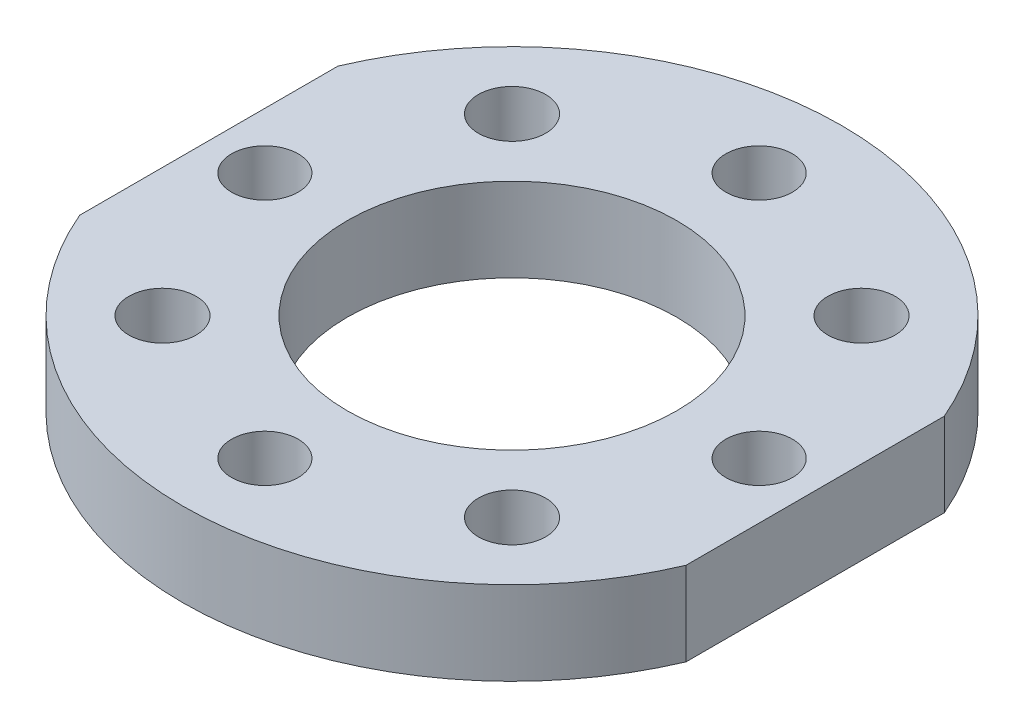
ISO-10303-21;
HEADER;
FILE_DESCRIPTION(('STEP AP214'),'2;1');
FILE_NAME('part.step','',(''),(''),'','','');
FILE_SCHEMA(('AUTOMOTIVE_DESIGN { 1 0 10303 214 1 1 1 1 }'));
ENDSEC;
DATA;
#1=APPLICATION_CONTEXT('core data for automotive mechanical design processes');
#2=APPLICATION_PROTOCOL_DEFINITION('international standard','automotive_design',2000,#1);
#3=PRODUCT_CONTEXT('',#1,'mechanical');
#4=PRODUCT('Part','Part','',(#3));
#5=PRODUCT_RELATED_PRODUCT_CATEGORY('part','',(#4));
#6=PRODUCT_DEFINITION_FORMATION('','',#4);
#7=PRODUCT_DEFINITION_CONTEXT('part definition',#1,'design');
#8=PRODUCT_DEFINITION('design','',#6,#7);
#9=PRODUCT_DEFINITION_SHAPE('','',#8);
#10=(LENGTH_UNIT() NAMED_UNIT(*) SI_UNIT(.MILLI.,.METRE.));
#11=(NAMED_UNIT(*) PLANE_ANGLE_UNIT() SI_UNIT($,.RADIAN.));
#12=(NAMED_UNIT(*) SI_UNIT($,.STERADIAN.) SOLID_ANGLE_UNIT());
#13=UNCERTAINTY_MEASURE_WITH_UNIT(LENGTH_MEASURE(1.E-05),#10,'distance_accuracy_value','');
#14=(GEOMETRIC_REPRESENTATION_CONTEXT(3) GLOBAL_UNCERTAINTY_ASSIGNED_CONTEXT((#13)) GLOBAL_UNIT_ASSIGNED_CONTEXT((#10,
#11,#12)) REPRESENTATION_CONTEXT('',''));
#15=CARTESIAN_POINT('',(0.,0.,0.));
#16=DIRECTION('',(0.,0.,1.));
#17=DIRECTION('',(1.,0.,0.));
#18=AXIS2_PLACEMENT_3D('',#15,#16,#17);
#19=CARTESIAN_POINT('',(0.,106.35,0.));
#20=DIRECTION('',(0.,1.,0.));
#21=DIRECTION('',(0.,0.,1.));
#22=AXIS2_PLACEMENT_3D('',#19,#20,#21);
#23=PLANE('',#22);
#24=CARTESIAN_POINT('',(-13.2582521472478,106.35,13.2582521472478));
#25=DIRECTION('',(0.,1.,0.));
#26=DIRECTION('',(0.,0.,1.));
#27=AXIS2_PLACEMENT_3D('',#24,#25,#26);
#28=CIRCLE('',#27,2.5527);
#29=CARTESIAN_POINT('',(-13.2582521472478,106.35,15.8109521472478));
#30=VERTEX_POINT('',#29);
#31=EDGE_CURVE('E178',#30,#30,#28,.T.);
#32=ORIENTED_EDGE('',*,*,#31,.F.);
#33=EDGE_LOOP('',(#32));
#34=FACE_BOUND('',#33,.T.);
#35=CARTESIAN_POINT('',(-13.2582521472478,106.35,-13.2582521472478));
#36=DIRECTION('',(0.,1.,0.));
#37=DIRECTION('',(0.,0.,1.));
#38=AXIS2_PLACEMENT_3D('',#35,#36,#37);
#39=CIRCLE('',#38,2.5527);
#40=CARTESIAN_POINT('',(-13.2582521472478,106.35,-10.7055521472478));
#41=VERTEX_POINT('',#40);
#42=EDGE_CURVE('E172',#41,#41,#39,.T.);
#43=ORIENTED_EDGE('',*,*,#42,.F.);
#44=EDGE_LOOP('',(#43));
#45=FACE_BOUND('',#44,.T.);
#46=CARTESIAN_POINT('',(13.2582521472478,106.35,-13.2582521472478));
#47=DIRECTION('',(0.,1.,0.));
#48=DIRECTION('',(0.,0.,1.));
#49=AXIS2_PLACEMENT_3D('',#46,#47,#48);
#50=CIRCLE('',#49,2.5527);
#51=CARTESIAN_POINT('',(13.2582521472478,106.35,-10.7055521472478));
#52=VERTEX_POINT('',#51);
#53=EDGE_CURVE('E166',#52,#52,#50,.T.);
#54=ORIENTED_EDGE('',*,*,#53,.F.);
#55=EDGE_LOOP('',(#54));
#56=FACE_BOUND('',#55,.T.);
#57=CARTESIAN_POINT('',(13.2582521472478,106.35,13.2582521472478));
#58=DIRECTION('',(0.,1.,0.));
#59=DIRECTION('',(0.,0.,1.));
#60=AXIS2_PLACEMENT_3D('',#57,#58,#59);
#61=CIRCLE('',#60,2.5527);
#62=CARTESIAN_POINT('',(13.2582521472478,106.35,15.8109521472478));
#63=VERTEX_POINT('',#62);
#64=EDGE_CURVE('E160',#63,#63,#61,.T.);
#65=ORIENTED_EDGE('',*,*,#64,.F.);
#66=EDGE_LOOP('',(#65));
#67=FACE_BOUND('',#66,.T.);
#68=CARTESIAN_POINT('',(0.,106.35,18.75));
#69=DIRECTION('',(0.,1.,0.));
#70=DIRECTION('',(0.,0.,1.));
#71=AXIS2_PLACEMENT_3D('',#68,#69,#70);
#72=CIRCLE('',#71,2.5273);
#73=CARTESIAN_POINT('',(0.,106.35,21.2773));
#74=VERTEX_POINT('',#73);
#75=EDGE_CURVE('E143',#74,#74,#72,.T.);
#76=ORIENTED_EDGE('',*,*,#75,.F.);
#77=EDGE_LOOP('',(#76));
#78=FACE_BOUND('',#77,.T.);
#79=CARTESIAN_POINT('',(0.,106.35,-18.75));
#80=DIRECTION('',(0.,1.,0.));
#81=DIRECTION('',(0.,0.,1.));
#82=AXIS2_PLACEMENT_3D('',#79,#80,#81);
#83=CIRCLE('',#82,2.5273);
#84=CARTESIAN_POINT('',(0.,106.35,-16.2227));
#85=VERTEX_POINT('',#84);
#86=EDGE_CURVE('E131',#85,#85,#83,.T.);
#87=ORIENTED_EDGE('',*,*,#86,.F.);
#88=EDGE_LOOP('',(#87));
#89=FACE_BOUND('',#88,.T.);
#90=CARTESIAN_POINT('',(0.,106.35,0.));
#91=DIRECTION('',(0.,1.,0.));
#92=DIRECTION('',(0.,0.,1.));
#93=AXIS2_PLACEMENT_3D('',#90,#91,#92);
#94=CIRCLE('',#93,25.);
#95=CARTESIAN_POINT('',(-23.,106.35,9.79795897113271));
#96=VERTEX_POINT('',#95);
#97=CARTESIAN_POINT('',(23.,106.35,9.79795897113272));
#98=VERTEX_POINT('',#97);
#99=EDGE_CURVE('E101',#96,#98,#94,.T.);
#100=ORIENTED_EDGE('',*,*,#99,.T.);
#101=DIRECTION('',(0.,0.,-1.));
#102=VECTOR('',#101,1.);
#103=CARTESIAN_POINT('',(23.,106.35,9.79795897113272));
#104=LINE('',#103,#102);
#105=CARTESIAN_POINT('',(23.,106.35,-9.79795897113272));
#106=VERTEX_POINT('',#105);
#107=EDGE_CURVE('E96',#98,#106,#104,.T.);
#108=ORIENTED_EDGE('',*,*,#107,.T.);
#109=CARTESIAN_POINT('',(0.,106.35,0.));
#110=DIRECTION('',(0.,1.,0.));
#111=DIRECTION('',(0.,0.,1.));
#112=AXIS2_PLACEMENT_3D('',#109,#110,#111);
#113=CIRCLE('',#112,25.);
#114=CARTESIAN_POINT('',(-23.,106.35,-9.79795897113272));
#115=VERTEX_POINT('',#114);
#116=EDGE_CURVE('E99',#106,#115,#113,.T.);
#117=ORIENTED_EDGE('',*,*,#116,.T.);
#118=DIRECTION('',(0.,0.,1.));
#119=VECTOR('',#118,1.);
#120=CARTESIAN_POINT('',(-23.,106.35,-9.79795897113271));
#121=LINE('',#120,#119);
#122=EDGE_CURVE('E66',#115,#96,#121,.T.);
#123=ORIENTED_EDGE('',*,*,#122,.T.);
#124=EDGE_LOOP('',(#100,#108,#117,#123));
#125=FACE_BOUND('',#124,.T.);
#126=CARTESIAN_POINT('',(-18.75,106.35,0.));
#127=DIRECTION('',(0.,1.,0.));
#128=DIRECTION('',(0.,0.,1.));
#129=AXIS2_PLACEMENT_3D('',#126,#127,#128);
#130=CIRCLE('',#129,2.5273);
#131=CARTESIAN_POINT('',(-18.75,106.35,2.5273));
#132=VERTEX_POINT('',#131);
#133=EDGE_CURVE('E116',#132,#132,#130,.T.);
#134=ORIENTED_EDGE('',*,*,#133,.F.);
#135=EDGE_LOOP('',(#134));
#136=FACE_BOUND('',#135,.T.);
#137=CARTESIAN_POINT('',(18.75,106.35,0.));
#138=DIRECTION('',(0.,1.,0.));
#139=DIRECTION('',(0.,0.,1.));
#140=AXIS2_PLACEMENT_3D('',#137,#138,#139);
#141=CIRCLE('',#140,2.5273);
#142=CARTESIAN_POINT('',(18.75,106.35,2.5273));
#143=VERTEX_POINT('',#142);
#144=EDGE_CURVE('E137',#143,#143,#141,.T.);
#145=ORIENTED_EDGE('',*,*,#144,.F.);
#146=EDGE_LOOP('',(#145));
#147=FACE_BOUND('',#146,.T.);
#148=CARTESIAN_POINT('',(0.,106.35,0.));
#149=DIRECTION('',(0.,1.,0.));
#150=DIRECTION('',(0.,0.,1.));
#151=AXIS2_PLACEMENT_3D('',#148,#149,#150);
#152=CIRCLE('',#151,12.5);
#153=CARTESIAN_POINT('',(0.,106.35,12.5));
#154=VERTEX_POINT('',#153);
#155=EDGE_CURVE('E149',#154,#154,#152,.T.);
#156=ORIENTED_EDGE('',*,*,#155,.F.);
#157=EDGE_LOOP('',(#156));
#158=FACE_BOUND('',#157,.T.);
#159=ADVANCED_FACE('F49',(#34,#45,#56,#67,#78,#89,#125,#136,#147,#158),#23,.T.);
#160=CARTESIAN_POINT('',(0.,100.,0.));
#161=DIRECTION('',(0.,1.,0.));
#162=DIRECTION('',(0.,0.,1.));
#163=AXIS2_PLACEMENT_3D('',#160,#161,#162);
#164=PLANE('',#163);
#165=CARTESIAN_POINT('',(-13.2582521472478,100.,13.2582521472478));
#166=DIRECTION('',(0.,1.,0.));
#167=DIRECTION('',(0.,0.,1.));
#168=AXIS2_PLACEMENT_3D('',#165,#166,#167);
#169=CIRCLE('',#168,2.5527);
#170=CARTESIAN_POINT('',(-13.2582521472478,100.,15.8109521472478));
#171=VERTEX_POINT('',#170);
#172=EDGE_CURVE('E175',#171,#171,#169,.T.);
#173=ORIENTED_EDGE('',*,*,#172,.T.);
#174=EDGE_LOOP('',(#173));
#175=FACE_BOUND('',#174,.T.);
#176=CARTESIAN_POINT('',(-13.2582521472478,100.,-13.2582521472478));
#177=DIRECTION('',(0.,1.,0.));
#178=DIRECTION('',(0.,0.,1.));
#179=AXIS2_PLACEMENT_3D('',#176,#177,#178);
#180=CIRCLE('',#179,2.5527);
#181=CARTESIAN_POINT('',(-13.2582521472478,100.,-10.7055521472478));
#182=VERTEX_POINT('',#181);
#183=EDGE_CURVE('E169',#182,#182,#180,.T.);
#184=ORIENTED_EDGE('',*,*,#183,.T.);
#185=EDGE_LOOP('',(#184));
#186=FACE_BOUND('',#185,.T.);
#187=CARTESIAN_POINT('',(13.2582521472478,100.,-13.2582521472478));
#188=DIRECTION('',(0.,1.,0.));
#189=DIRECTION('',(0.,0.,1.));
#190=AXIS2_PLACEMENT_3D('',#187,#188,#189);
#191=CIRCLE('',#190,2.5527);
#192=CARTESIAN_POINT('',(13.2582521472478,100.,-10.7055521472478));
#193=VERTEX_POINT('',#192);
#194=EDGE_CURVE('E163',#193,#193,#191,.T.);
#195=ORIENTED_EDGE('',*,*,#194,.T.);
#196=EDGE_LOOP('',(#195));
#197=FACE_BOUND('',#196,.T.);
#198=CARTESIAN_POINT('',(13.2582521472478,100.,13.2582521472478));
#199=DIRECTION('',(0.,1.,0.));
#200=DIRECTION('',(0.,0.,1.));
#201=AXIS2_PLACEMENT_3D('',#198,#199,#200);
#202=CIRCLE('',#201,2.5527);
#203=CARTESIAN_POINT('',(13.2582521472478,100.,15.8109521472478));
#204=VERTEX_POINT('',#203);
#205=EDGE_CURVE('E155',#204,#204,#202,.T.);
#206=ORIENTED_EDGE('',*,*,#205,.T.);
#207=EDGE_LOOP('',(#206));
#208=FACE_BOUND('',#207,.T.);
#209=CARTESIAN_POINT('',(0.,100.,0.));
#210=DIRECTION('',(0.,1.,0.));
#211=DIRECTION('',(0.,0.,1.));
#212=AXIS2_PLACEMENT_3D('',#209,#210,#211);
#213=CIRCLE('',#212,25.);
#214=CARTESIAN_POINT('',(-23.,100.,9.79795897113271));
#215=VERTEX_POINT('',#214);
#216=CARTESIAN_POINT('',(23.,100.,9.79795897113272));
#217=VERTEX_POINT('',#216);
#218=EDGE_CURVE('E113',#215,#217,#213,.T.);
#219=ORIENTED_EDGE('',*,*,#218,.F.);
#220=DIRECTION('',(0.,0.,1.));
#221=VECTOR('',#220,1.);
#222=CARTESIAN_POINT('',(-23.,100.,-9.79795897113271));
#223=LINE('',#222,#221);
#224=CARTESIAN_POINT('',(-23.,100.,-9.79795897113272));
#225=VERTEX_POINT('',#224);
#226=EDGE_CURVE('E89',#225,#215,#223,.T.);
#227=ORIENTED_EDGE('',*,*,#226,.F.);
#228=CARTESIAN_POINT('',(0.,100.,0.));
#229=DIRECTION('',(0.,1.,0.));
#230=DIRECTION('',(0.,0.,1.));
#231=AXIS2_PLACEMENT_3D('',#228,#229,#230);
#232=CIRCLE('',#231,25.);
#233=CARTESIAN_POINT('',(23.,100.,-9.79795897113272));
#234=VERTEX_POINT('',#233);
#235=EDGE_CURVE('E83',#234,#225,#232,.T.);
#236=ORIENTED_EDGE('',*,*,#235,.F.);
#237=DIRECTION('',(0.,0.,-1.));
#238=VECTOR('',#237,1.);
#239=CARTESIAN_POINT('',(23.,100.,9.79795897113272));
#240=LINE('',#239,#238);
#241=EDGE_CURVE('E105',#217,#234,#240,.T.);
#242=ORIENTED_EDGE('',*,*,#241,.F.);
#243=EDGE_LOOP('',(#219,#227,#236,#242));
#244=FACE_BOUND('',#243,.T.);
#245=CARTESIAN_POINT('',(-18.75,100.,0.));
#246=DIRECTION('',(0.,1.,0.));
#247=DIRECTION('',(0.,0.,1.));
#248=AXIS2_PLACEMENT_3D('',#245,#246,#247);
#249=CIRCLE('',#248,2.5273);
#250=CARTESIAN_POINT('',(-18.75,100.,2.5273));
#251=VERTEX_POINT('',#250);
#252=EDGE_CURVE('E128',#251,#251,#249,.T.);
#253=ORIENTED_EDGE('',*,*,#252,.T.);
#254=EDGE_LOOP('',(#253));
#255=FACE_BOUND('',#254,.T.);
#256=CARTESIAN_POINT('',(0.,100.,-18.75));
#257=DIRECTION('',(0.,1.,0.));
#258=DIRECTION('',(0.,0.,1.));
#259=AXIS2_PLACEMENT_3D('',#256,#257,#258);
#260=CIRCLE('',#259,2.5273);
#261=CARTESIAN_POINT('',(0.,100.,-16.2227));
#262=VERTEX_POINT('',#261);
#263=EDGE_CURVE('E134',#262,#262,#260,.T.);
#264=ORIENTED_EDGE('',*,*,#263,.T.);
#265=EDGE_LOOP('',(#264));
#266=FACE_BOUND('',#265,.T.);
#267=CARTESIAN_POINT('',(18.75,100.,0.));
#268=DIRECTION('',(0.,1.,0.));
#269=DIRECTION('',(0.,0.,1.));
#270=AXIS2_PLACEMENT_3D('',#267,#268,#269);
#271=CIRCLE('',#270,2.5273);
#272=CARTESIAN_POINT('',(18.75,100.,2.5273));
#273=VERTEX_POINT('',#272);
#274=EDGE_CURVE('E140',#273,#273,#271,.T.);
#275=ORIENTED_EDGE('',*,*,#274,.T.);
#276=EDGE_LOOP('',(#275));
#277=FACE_BOUND('',#276,.T.);
#278=CARTESIAN_POINT('',(0.,100.,18.75));
#279=DIRECTION('',(0.,1.,0.));
#280=DIRECTION('',(0.,0.,1.));
#281=AXIS2_PLACEMENT_3D('',#278,#279,#280);
#282=CIRCLE('',#281,2.5273);
#283=CARTESIAN_POINT('',(0.,100.,21.2773));
#284=VERTEX_POINT('',#283);
#285=EDGE_CURVE('E146',#284,#284,#282,.T.);
#286=ORIENTED_EDGE('',*,*,#285,.T.);
#287=EDGE_LOOP('',(#286));
#288=FACE_BOUND('',#287,.T.);
#289=CARTESIAN_POINT('',(0.,100.,0.));
#290=DIRECTION('',(0.,1.,0.));
#291=DIRECTION('',(0.,0.,1.));
#292=AXIS2_PLACEMENT_3D('',#289,#290,#291);
#293=CIRCLE('',#292,12.5);
#294=CARTESIAN_POINT('',(0.,100.,12.5));
#295=VERTEX_POINT('',#294);
#296=EDGE_CURVE('E152',#295,#295,#293,.T.);
#297=ORIENTED_EDGE('',*,*,#296,.T.);
#298=EDGE_LOOP('',(#297));
#299=FACE_BOUND('',#298,.T.);
#300=ADVANCED_FACE('F124',(#175,#186,#197,#208,#244,#255,#266,#277,#288,#299),#164,.F.);
#301=CARTESIAN_POINT('',(0.,106.35,0.));
#302=DIRECTION('',(0.,-1.,0.));
#303=DIRECTION('',(0.,0.,-1.));
#304=AXIS2_PLACEMENT_3D('',#301,#302,#303);
#305=CYLINDRICAL_SURFACE('',#304,25.);
#306=ORIENTED_EDGE('',*,*,#218,.T.);
#307=DIRECTION('',(0.,-1.,0.));
#308=VECTOR('',#307,1.);
#309=CARTESIAN_POINT('',(23.,106.35,9.79795897113272));
#310=LINE('',#309,#308);
#311=EDGE_CURVE('E13',#98,#217,#310,.T.);
#312=ORIENTED_EDGE('',*,*,#311,.F.);
#313=ORIENTED_EDGE('',*,*,#99,.F.);
#314=DIRECTION('',(0.,-1.,0.));
#315=VECTOR('',#314,1.);
#316=CARTESIAN_POINT('',(-23.,106.35,9.79795897113271));
#317=LINE('',#316,#315);
#318=EDGE_CURVE('E109',#96,#215,#317,.T.);
#319=ORIENTED_EDGE('',*,*,#318,.T.);
#320=EDGE_LOOP('',(#306,#312,#313,#319));
#321=FACE_BOUND('',#320,.T.);
#322=ADVANCED_FACE('F51',(#321),#305,.T.);
#323=CARTESIAN_POINT('',(23.,106.35,9.79795897113272));
#324=DIRECTION('',(-1.,0.,0.));
#325=DIRECTION('',(0.,0.,1.));
#326=AXIS2_PLACEMENT_3D('',#323,#324,#325);
#327=PLANE('',#326);
#328=ORIENTED_EDGE('',*,*,#241,.T.);
#329=DIRECTION('',(0.,-1.,0.));
#330=VECTOR('',#329,1.);
#331=CARTESIAN_POINT('',(23.,106.35,-9.79795897113272));
#332=LINE('',#331,#330);
#333=EDGE_CURVE('E58',#106,#234,#332,.T.);
#334=ORIENTED_EDGE('',*,*,#333,.F.);
#335=ORIENTED_EDGE('',*,*,#107,.F.);
#336=ORIENTED_EDGE('',*,*,#311,.T.);
#337=EDGE_LOOP('',(#328,#334,#335,#336));
#338=FACE_BOUND('',#337,.T.);
#339=ADVANCED_FACE('F104',(#338),#327,.F.);
#340=CARTESIAN_POINT('',(0.,106.35,0.));
#341=DIRECTION('',(0.,-1.,0.));
#342=DIRECTION('',(0.,0.,-1.));
#343=AXIS2_PLACEMENT_3D('',#340,#341,#342);
#344=CYLINDRICAL_SURFACE('',#343,25.);
#345=ORIENTED_EDGE('',*,*,#235,.T.);
#346=DIRECTION('',(0.,-1.,0.));
#347=VECTOR('',#346,1.);
#348=CARTESIAN_POINT('',(-23.,106.35,-9.79795897113272));
#349=LINE('',#348,#347);
#350=EDGE_CURVE('E106',#115,#225,#349,.T.);
#351=ORIENTED_EDGE('',*,*,#350,.F.);
#352=ORIENTED_EDGE('',*,*,#116,.F.);
#353=ORIENTED_EDGE('',*,*,#333,.T.);
#354=EDGE_LOOP('',(#345,#351,#352,#353));
#355=FACE_BOUND('',#354,.T.);
#356=ADVANCED_FACE('F107',(#355),#344,.T.);
#357=CARTESIAN_POINT('',(-23.,106.35,-9.79795897113271));
#358=DIRECTION('',(1.,0.,0.));
#359=DIRECTION('',(0.,0.,-1.));
#360=AXIS2_PLACEMENT_3D('',#357,#358,#359);
#361=PLANE('',#360);
#362=ORIENTED_EDGE('',*,*,#226,.T.);
#363=ORIENTED_EDGE('',*,*,#318,.F.);
#364=ORIENTED_EDGE('',*,*,#122,.F.);
#365=ORIENTED_EDGE('',*,*,#350,.T.);
#366=EDGE_LOOP('',(#362,#363,#364,#365));
#367=FACE_BOUND('',#366,.T.);
#368=ADVANCED_FACE('F121',(#367),#361,.F.);
#369=CARTESIAN_POINT('',(-18.75,106.35,0.));
#370=DIRECTION('',(0.,-1.,0.));
#371=DIRECTION('',(0.,0.,-1.));
#372=AXIS2_PLACEMENT_3D('',#369,#370,#371);
#373=CYLINDRICAL_SURFACE('',#372,2.5273);
#374=ORIENTED_EDGE('',*,*,#133,.T.);
#375=EDGE_LOOP('',(#374));
#376=FACE_BOUND('',#375,.T.);
#377=ORIENTED_EDGE('',*,*,#252,.F.);
#378=EDGE_LOOP('',(#377));
#379=FACE_BOUND('',#378,.T.);
#380=ADVANCED_FACE('F201',(#376,#379),#373,.F.);
#381=CARTESIAN_POINT('',(0.,106.35,-18.75));
#382=DIRECTION('',(0.,-1.,0.));
#383=DIRECTION('',(0.,0.,-1.));
#384=AXIS2_PLACEMENT_3D('',#381,#382,#383);
#385=CYLINDRICAL_SURFACE('',#384,2.5273);
#386=ORIENTED_EDGE('',*,*,#86,.T.);
#387=EDGE_LOOP('',(#386));
#388=FACE_BOUND('',#387,.T.);
#389=ORIENTED_EDGE('',*,*,#263,.F.);
#390=EDGE_LOOP('',(#389));
#391=FACE_BOUND('',#390,.T.);
#392=ADVANCED_FACE('F197',(#388,#391),#385,.F.);
#393=CARTESIAN_POINT('',(18.75,106.35,0.));
#394=DIRECTION('',(0.,-1.,0.));
#395=DIRECTION('',(0.,0.,-1.));
#396=AXIS2_PLACEMENT_3D('',#393,#394,#395);
#397=CYLINDRICAL_SURFACE('',#396,2.5273);
#398=ORIENTED_EDGE('',*,*,#144,.T.);
#399=EDGE_LOOP('',(#398));
#400=FACE_BOUND('',#399,.T.);
#401=ORIENTED_EDGE('',*,*,#274,.F.);
#402=EDGE_LOOP('',(#401));
#403=FACE_BOUND('',#402,.T.);
#404=ADVANCED_FACE('F200',(#400,#403),#397,.F.);
#405=CARTESIAN_POINT('',(0.,106.35,18.75));
#406=DIRECTION('',(0.,-1.,0.));
#407=DIRECTION('',(0.,0.,-1.));
#408=AXIS2_PLACEMENT_3D('',#405,#406,#407);
#409=CYLINDRICAL_SURFACE('',#408,2.5273);
#410=ORIENTED_EDGE('',*,*,#75,.T.);
#411=EDGE_LOOP('',(#410));
#412=FACE_BOUND('',#411,.T.);
#413=ORIENTED_EDGE('',*,*,#285,.F.);
#414=EDGE_LOOP('',(#413));
#415=FACE_BOUND('',#414,.T.);
#416=ADVANCED_FACE('F218',(#412,#415),#409,.F.);
#417=CARTESIAN_POINT('',(0.,106.35,0.));
#418=DIRECTION('',(0.,-1.,0.));
#419=DIRECTION('',(0.,0.,-1.));
#420=AXIS2_PLACEMENT_3D('',#417,#418,#419);
#421=CYLINDRICAL_SURFACE('',#420,12.5);
#422=ORIENTED_EDGE('',*,*,#155,.T.);
#423=EDGE_LOOP('',(#422));
#424=FACE_BOUND('',#423,.T.);
#425=ORIENTED_EDGE('',*,*,#296,.F.);
#426=EDGE_LOOP('',(#425));
#427=FACE_BOUND('',#426,.T.);
#428=ADVANCED_FACE('F215',(#424,#427),#421,.F.);
#429=CARTESIAN_POINT('',(13.2582521472478,106.35,13.2582521472478));
#430=DIRECTION('',(0.,1.,0.));
#431=DIRECTION('',(0.,0.,1.));
#432=AXIS2_PLACEMENT_3D('',#429,#430,#431);
#433=CYLINDRICAL_SURFACE('',#432,2.5527);
#434=ORIENTED_EDGE('',*,*,#205,.F.);
#435=EDGE_LOOP('',(#434));
#436=FACE_BOUND('',#435,.T.);
#437=ORIENTED_EDGE('',*,*,#64,.T.);
#438=EDGE_LOOP('',(#437));
#439=FACE_BOUND('',#438,.T.);
#440=ADVANCED_FACE('F217',(#436,#439),#433,.F.);
#441=CARTESIAN_POINT('',(13.2582521472478,106.35,-13.2582521472478));
#442=DIRECTION('',(0.,1.,0.));
#443=DIRECTION('',(0.,0.,1.));
#444=AXIS2_PLACEMENT_3D('',#441,#442,#443);
#445=CYLINDRICAL_SURFACE('',#444,2.5527);
#446=ORIENTED_EDGE('',*,*,#194,.F.);
#447=EDGE_LOOP('',(#446));
#448=FACE_BOUND('',#447,.T.);
#449=ORIENTED_EDGE('',*,*,#53,.T.);
#450=EDGE_LOOP('',(#449));
#451=FACE_BOUND('',#450,.T.);
#452=ADVANCED_FACE('F225',(#448,#451),#445,.F.);
#453=CARTESIAN_POINT('',(-13.2582521472478,106.35,-13.2582521472478));
#454=DIRECTION('',(0.,1.,0.));
#455=DIRECTION('',(0.,0.,1.));
#456=AXIS2_PLACEMENT_3D('',#453,#454,#455);
#457=CYLINDRICAL_SURFACE('',#456,2.5527);
#458=ORIENTED_EDGE('',*,*,#183,.F.);
#459=EDGE_LOOP('',(#458));
#460=FACE_BOUND('',#459,.T.);
#461=ORIENTED_EDGE('',*,*,#42,.T.);
#462=EDGE_LOOP('',(#461));
#463=FACE_BOUND('',#462,.T.);
#464=ADVANCED_FACE('F317',(#460,#463),#457,.F.);
#465=CARTESIAN_POINT('',(-13.2582521472478,106.35,13.2582521472478));
#466=DIRECTION('',(0.,1.,0.));
#467=DIRECTION('',(0.,0.,1.));
#468=AXIS2_PLACEMENT_3D('',#465,#466,#467);
#469=CYLINDRICAL_SURFACE('',#468,2.5527);
#470=ORIENTED_EDGE('',*,*,#172,.F.);
#471=EDGE_LOOP('',(#470));
#472=FACE_BOUND('',#471,.T.);
#473=ORIENTED_EDGE('',*,*,#31,.T.);
#474=EDGE_LOOP('',(#473));
#475=FACE_BOUND('',#474,.T.);
#476=ADVANCED_FACE('F182',(#472,#475),#469,.F.);
#477=CLOSED_SHELL('',(#159,#300,#322,#339,#356,#368,#380,#392,#404,#416,#428,#440,#452,#464,#476));
#478=MANIFOLD_SOLID_BREP('B2',#477);
#479=ADVANCED_BREP_SHAPE_REPRESENTATION('',(#18,#478),#14);
#480=SHAPE_DEFINITION_REPRESENTATION(#9,#479);
ENDSEC;
END-ISO-10303-21;
